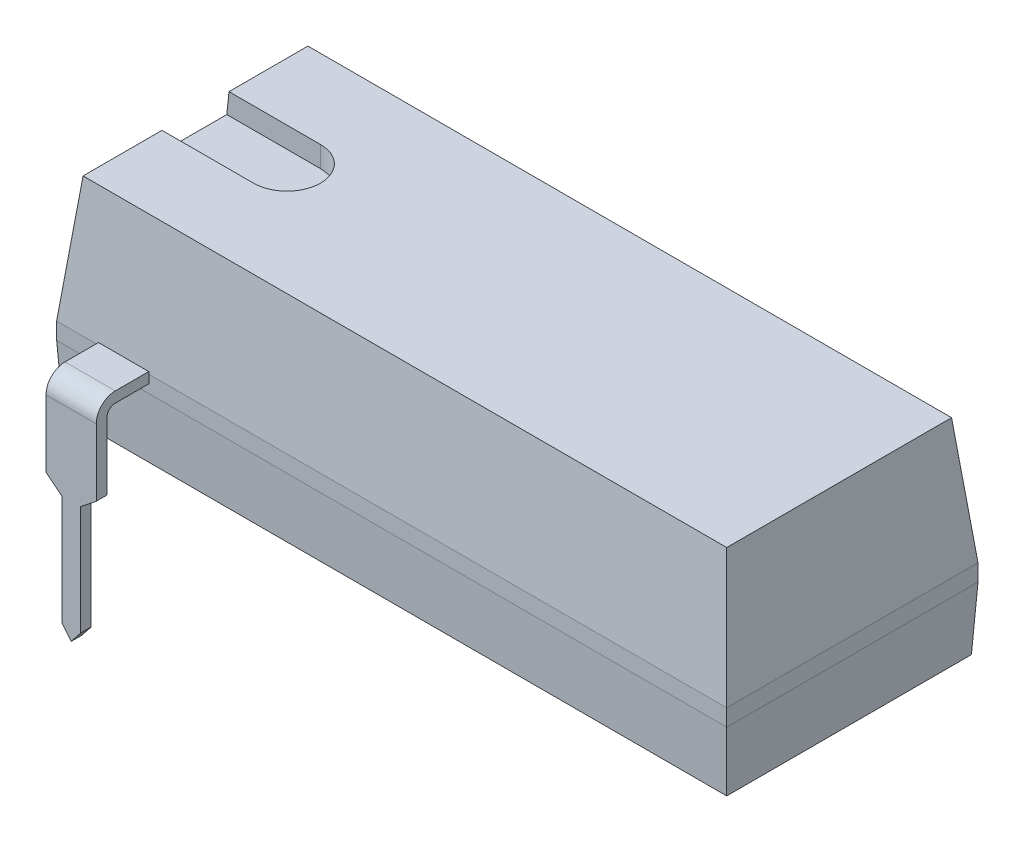
ISO-10303-21;
HEADER;
FILE_DESCRIPTION(('STEP AP214'),'2;1');
FILE_NAME('part.step','',(''),(''),'','','');
FILE_SCHEMA(('AUTOMOTIVE_DESIGN { 1 0 10303 214 1 1 1 1 }'));
ENDSEC;
DATA;
#1=APPLICATION_CONTEXT('core data for automotive mechanical design processes');
#2=APPLICATION_PROTOCOL_DEFINITION('international standard','automotive_design',2000,#1);
#3=PRODUCT_CONTEXT('',#1,'mechanical');
#4=PRODUCT('Part','Part','',(#3));
#5=PRODUCT_RELATED_PRODUCT_CATEGORY('part','',(#4));
#6=PRODUCT_DEFINITION_FORMATION('','',#4);
#7=PRODUCT_DEFINITION_CONTEXT('part definition',#1,'design');
#8=PRODUCT_DEFINITION('design','',#6,#7);
#9=PRODUCT_DEFINITION_SHAPE('','',#8);
#10=(LENGTH_UNIT() NAMED_UNIT(*) SI_UNIT(.MILLI.,.METRE.));
#11=(NAMED_UNIT(*) PLANE_ANGLE_UNIT() SI_UNIT($,.RADIAN.));
#12=(NAMED_UNIT(*) SI_UNIT($,.STERADIAN.) SOLID_ANGLE_UNIT());
#13=UNCERTAINTY_MEASURE_WITH_UNIT(LENGTH_MEASURE(1.E-05),#10,'distance_accuracy_value','');
#14=(GEOMETRIC_REPRESENTATION_CONTEXT(3) GLOBAL_UNCERTAINTY_ASSIGNED_CONTEXT((#13)) GLOBAL_UNIT_ASSIGNED_CONTEXT((#10,
#11,#12)) REPRESENTATION_CONTEXT('',''));
#15=CARTESIAN_POINT('',(0.,0.,0.));
#16=DIRECTION('',(0.,0.,1.));
#17=DIRECTION('',(1.,0.,0.));
#18=AXIS2_PLACEMENT_3D('',#15,#16,#17);
#19=CARTESIAN_POINT('',(-1.,0.4,3.));
#20=DIRECTION('',(0.,0.,-1.));
#21=DIRECTION('',(-1.,0.,0.));
#22=AXIS2_PLACEMENT_3D('',#19,#20,#21);
#23=PLANE('',#22);
#24=DIRECTION('',(0.,-1.,0.));
#25=VECTOR('',#24,1.);
#26=CARTESIAN_POINT('',(0.,0.454,3.));
#27=LINE('',#26,#25);
#28=CARTESIAN_POINT('',(0.,0.4,3.));
#29=VERTEX_POINT('',#28);
#30=CARTESIAN_POINT('',(0.,0.2,3.));
#31=VERTEX_POINT('',#30);
#32=EDGE_CURVE('E11',#29,#31,#27,.T.);
#33=ORIENTED_EDGE('',*,*,#32,.F.);
#34=DIRECTION('',(1.,0.,0.));
#35=VECTOR('',#34,1.);
#36=CARTESIAN_POINT('',(-1.,0.4,3.));
#37=LINE('',#36,#35);
#38=CARTESIAN_POINT('',(-1.,0.4,3.));
#39=VERTEX_POINT('',#38);
#40=EDGE_CURVE('E341',#39,#29,#37,.T.);
#41=ORIENTED_EDGE('',*,*,#40,.F.);
#42=DIRECTION('',(0.,-1.,0.));
#43=VECTOR('',#42,1.);
#44=CARTESIAN_POINT('',(-1.,0.4,3.));
#45=LINE('',#44,#43);
#46=CARTESIAN_POINT('',(-1.,0.,3.));
#47=VERTEX_POINT('',#46);
#48=EDGE_CURVE('E370',#39,#47,#45,.T.);
#49=ORIENTED_EDGE('',*,*,#48,.T.);
#50=DIRECTION('',(1.,0.,0.));
#51=VECTOR('',#50,1.);
#52=CARTESIAN_POINT('',(-1.,0.,3.));
#53=LINE('',#52,#51);
#54=CARTESIAN_POINT('',(15.,0.,3.));
#55=VERTEX_POINT('',#54);
#56=EDGE_CURVE('E354',#47,#55,#53,.T.);
#57=ORIENTED_EDGE('',*,*,#56,.T.);
#58=DIRECTION('',(0.,-1.,0.));
#59=VECTOR('',#58,1.);
#60=CARTESIAN_POINT('',(15.,0.4,3.));
#61=LINE('',#60,#59);
#62=CARTESIAN_POINT('',(15.,0.4,3.));
#63=VERTEX_POINT('',#62);
#64=EDGE_CURVE('E367',#63,#55,#61,.T.);
#65=ORIENTED_EDGE('',*,*,#64,.F.);
#66=CARTESIAN_POINT('',(1.2,0.4,3.));
#67=VERTEX_POINT('',#66);
#68=EDGE_CURVE('E339',#67,#63,#37,.T.);
#69=ORIENTED_EDGE('',*,*,#68,.F.);
#70=DIRECTION('',(0.,-1.,0.));
#71=VECTOR('',#70,1.);
#72=CARTESIAN_POINT('',(1.2,0.454,3.));
#73=LINE('',#72,#71);
#74=CARTESIAN_POINT('',(1.2,0.2,3.));
#75=VERTEX_POINT('',#74);
#76=EDGE_CURVE('E42',#67,#75,#73,.T.);
#77=ORIENTED_EDGE('',*,*,#76,.T.);
#78=DIRECTION('',(-1.,0.,0.));
#79=VECTOR('',#78,1.);
#80=CARTESIAN_POINT('',(1.2,0.2,3.));
#81=LINE('',#80,#79);
#82=EDGE_CURVE('E262',#75,#31,#81,.T.);
#83=ORIENTED_EDGE('',*,*,#82,.T.);
#84=EDGE_LOOP('',(#33,#41,#49,#57,#65,#69,#77,#83));
#85=FACE_BOUND('',#84,.T.);
#86=ADVANCED_FACE('F33',(#85),#23,.F.);
#87=CARTESIAN_POINT('',(-1.,0.4,3.));
#88=DIRECTION('',(1.,0.,0.));
#89=DIRECTION('',(0.,0.,-1.));
#90=AXIS2_PLACEMENT_3D('',#87,#88,#89);
#91=PLANE('',#90);
#92=DIRECTION('',(0.,0.,1.));
#93=VECTOR('',#92,1.);
#94=CARTESIAN_POINT('',(-1.,0.,3.));
#95=LINE('',#94,#93);
#96=CARTESIAN_POINT('',(-1.,0.,-3.));
#97=VERTEX_POINT('',#96);
#98=EDGE_CURVE('E316',#97,#47,#95,.T.);
#99=ORIENTED_EDGE('',*,*,#98,.T.);
#100=ORIENTED_EDGE('',*,*,#48,.F.);
#101=DIRECTION('',(0.,0.,1.));
#102=VECTOR('',#101,1.);
#103=CARTESIAN_POINT('',(-1.,0.4,3.));
#104=LINE('',#103,#102);
#105=CARTESIAN_POINT('',(-1.,0.4,-3.));
#106=VERTEX_POINT('',#105);
#107=EDGE_CURVE('E336',#106,#39,#104,.T.);
#108=ORIENTED_EDGE('',*,*,#107,.F.);
#109=DIRECTION('',(0.,-1.,0.));
#110=VECTOR('',#109,1.);
#111=CARTESIAN_POINT('',(-1.,0.4,-3.));
#112=LINE('',#111,#110);
#113=EDGE_CURVE('E351',#106,#97,#112,.T.);
#114=ORIENTED_EDGE('',*,*,#113,.T.);
#115=EDGE_LOOP('',(#99,#100,#108,#114));
#116=FACE_BOUND('',#115,.T.);
#117=ADVANCED_FACE('F35',(#116),#91,.F.);
#118=CARTESIAN_POINT('',(15.,0.4,3.));
#119=DIRECTION('',(-1.,0.,0.));
#120=DIRECTION('',(0.,0.,1.));
#121=AXIS2_PLACEMENT_3D('',#118,#119,#120);
#122=PLANE('',#121);
#123=DIRECTION('',(0.,0.,-1.));
#124=VECTOR('',#123,1.);
#125=CARTESIAN_POINT('',(15.,0.,3.));
#126=LINE('',#125,#124);
#127=CARTESIAN_POINT('',(15.,0.,-3.));
#128=VERTEX_POINT('',#127);
#129=EDGE_CURVE('E357',#55,#128,#126,.T.);
#130=ORIENTED_EDGE('',*,*,#129,.T.);
#131=DIRECTION('',(0.,-1.,0.));
#132=VECTOR('',#131,1.);
#133=CARTESIAN_POINT('',(15.,0.4,-3.));
#134=LINE('',#133,#132);
#135=CARTESIAN_POINT('',(15.,0.4,-3.));
#136=VERTEX_POINT('',#135);
#137=EDGE_CURVE('E364',#136,#128,#134,.T.);
#138=ORIENTED_EDGE('',*,*,#137,.F.);
#139=DIRECTION('',(0.,0.,-1.));
#140=VECTOR('',#139,1.);
#141=CARTESIAN_POINT('',(15.,0.4,3.));
#142=LINE('',#141,#140);
#143=EDGE_CURVE('E344',#63,#136,#142,.T.);
#144=ORIENTED_EDGE('',*,*,#143,.F.);
#145=ORIENTED_EDGE('',*,*,#64,.T.);
#146=EDGE_LOOP('',(#130,#138,#144,#145));
#147=FACE_BOUND('',#146,.T.);
#148=ADVANCED_FACE('F459',(#147),#122,.F.);
#149=CARTESIAN_POINT('',(-1.,0.4,-3.));
#150=DIRECTION('',(0.,0.,1.));
#151=DIRECTION('',(1.,0.,0.));
#152=AXIS2_PLACEMENT_3D('',#149,#150,#151);
#153=PLANE('',#152);
#154=DIRECTION('',(-1.,0.,0.));
#155=VECTOR('',#154,1.);
#156=CARTESIAN_POINT('',(-1.,0.,-3.));
#157=LINE('',#156,#155);
#158=EDGE_CURVE('E340',#128,#97,#157,.T.);
#159=ORIENTED_EDGE('',*,*,#158,.T.);
#160=ORIENTED_EDGE('',*,*,#113,.F.);
#161=DIRECTION('',(-1.,0.,0.));
#162=VECTOR('',#161,1.);
#163=CARTESIAN_POINT('',(-1.,0.4,-3.));
#164=LINE('',#163,#162);
#165=EDGE_CURVE('E348',#136,#106,#164,.T.);
#166=ORIENTED_EDGE('',*,*,#165,.F.);
#167=ORIENTED_EDGE('',*,*,#137,.T.);
#168=EDGE_LOOP('',(#159,#160,#166,#167));
#169=FACE_BOUND('',#168,.T.);
#170=ADVANCED_FACE('F465',(#169),#153,.F.);
#171=CARTESIAN_POINT('',(15.,0.4,-3.));
#172=DIRECTION('',(0.,0.104528463267654,-0.994521895368273));
#173=DIRECTION('',(0.,0.994521895368273,0.104528463267654));
#174=AXIS2_PLACEMENT_3D('',#171,#172,#173);
#175=PLANE('',#174);
#176=ORIENTED_EDGE('',*,*,#165,.T.);
#177=DIRECTION('',(-0.103962051184498,-0.989132844377854,-0.103962051184498));
#178=VECTOR('',#177,1.);
#179=CARTESIAN_POINT('',(-1.,0.4,-3.));
#180=LINE('',#179,#178);
#181=CARTESIAN_POINT('',(-0.684687294202971,3.4,-2.68468729420297));
#182=VERTEX_POINT('',#181);
#183=EDGE_CURVE('E313',#182,#106,#180,.T.);
#184=ORIENTED_EDGE('',*,*,#183,.F.);
#185=DIRECTION('',(1.,0.,0.));
#186=VECTOR('',#185,1.);
#187=CARTESIAN_POINT('',(15.,3.4,-2.68468729420297));
#188=LINE('',#187,#186);
#189=CARTESIAN_POINT('',(14.684687294203,3.4,-2.68468729420297));
#190=VERTEX_POINT('',#189);
#191=EDGE_CURVE('E296',#190,#182,#188,.F.);
#192=ORIENTED_EDGE('',*,*,#191,.F.);
#193=DIRECTION('',(0.103962051184498,-0.989132844377854,-0.103962051184498));
#194=VECTOR('',#193,1.);
#195=CARTESIAN_POINT('',(15.,0.4,-3.));
#196=LINE('',#195,#194);
#197=EDGE_CURVE('E318',#190,#136,#196,.T.);
#198=ORIENTED_EDGE('',*,*,#197,.T.);
#199=EDGE_LOOP('',(#176,#184,#192,#198));
#200=FACE_BOUND('',#199,.T.);
#201=ADVANCED_FACE('F469',(#200),#175,.T.);
#202=CARTESIAN_POINT('',(-1.,0.4,-3.));
#203=DIRECTION('',(-0.994521895368273,0.104528463267653,0.));
#204=DIRECTION('',(-0.104528463267653,-0.994521895368273,0.));
#205=AXIS2_PLACEMENT_3D('',#202,#203,#204);
#206=PLANE('',#205);
#207=DIRECTION('',(0.,0.,1.));
#208=VECTOR('',#207,1.);
#209=CARTESIAN_POINT('',(-0.737239411835809,2.9,-3.));
#210=LINE('',#209,#208);
#211=CARTESIAN_POINT('',(-0.737239411835809,2.9,0.8));
#212=VERTEX_POINT('',#211);
#213=CARTESIAN_POINT('',(-0.737239411835809,2.9,-0.8));
#214=VERTEX_POINT('',#213);
#215=EDGE_CURVE('E37',#212,#214,#210,.F.);
#216=ORIENTED_EDGE('',*,*,#215,.T.);
#217=DIRECTION('',(-0.104528463267653,-0.994521895368273,0.));
#218=VECTOR('',#217,1.);
#219=CARTESIAN_POINT('',(-1.,0.4,-0.8));
#220=LINE('',#219,#218);
#221=CARTESIAN_POINT('',(-0.684687294202971,3.4,-0.8));
#222=VERTEX_POINT('',#221);
#223=EDGE_CURVE('E290',#214,#222,#220,.F.);
#224=ORIENTED_EDGE('',*,*,#223,.T.);
#225=DIRECTION('',(0.,0.,-1.));
#226=VECTOR('',#225,1.);
#227=CARTESIAN_POINT('',(-0.684687294202971,3.4,-3.));
#228=LINE('',#227,#226);
#229=EDGE_CURVE('E330',#182,#222,#228,.F.);
#230=ORIENTED_EDGE('',*,*,#229,.F.);
#231=ORIENTED_EDGE('',*,*,#183,.T.);
#232=ORIENTED_EDGE('',*,*,#107,.T.);
#233=DIRECTION('',(-0.103962051184498,-0.989132844377854,0.103962051184498));
#234=VECTOR('',#233,1.);
#235=CARTESIAN_POINT('',(-1.,0.4,3.));
#236=LINE('',#235,#234);
#237=CARTESIAN_POINT('',(-0.684687294202971,3.4,2.68468729420297));
#238=VERTEX_POINT('',#237);
#239=EDGE_CURVE('E317',#238,#39,#236,.T.);
#240=ORIENTED_EDGE('',*,*,#239,.F.);
#241=CARTESIAN_POINT('',(-0.684687294202971,3.4,0.8));
#242=VERTEX_POINT('',#241);
#243=EDGE_CURVE('E329',#242,#238,#228,.F.);
#244=ORIENTED_EDGE('',*,*,#243,.F.);
#245=DIRECTION('',(0.104528463267653,0.994521895368273,0.));
#246=VECTOR('',#245,1.);
#247=CARTESIAN_POINT('',(-1.,0.4,0.800000000000001));
#248=LINE('',#247,#246);
#249=EDGE_CURVE('E285',#242,#212,#248,.F.);
#250=ORIENTED_EDGE('',*,*,#249,.T.);
#251=EDGE_LOOP('',(#216,#224,#230,#231,#232,#240,#244,#250));
#252=FACE_BOUND('',#251,.T.);
#253=ADVANCED_FACE('F471',(#252),#206,.T.);
#254=CARTESIAN_POINT('',(-1.,0.4,3.));
#255=DIRECTION('',(0.,0.104528463267653,0.994521895368273));
#256=DIRECTION('',(0.,-0.994521895368273,0.104528463267653));
#257=AXIS2_PLACEMENT_3D('',#254,#255,#256);
#258=PLANE('',#257);
#259=ORIENTED_EDGE('',*,*,#40,.T.);
#260=EDGE_CURVE('E345',#29,#67,#37,.T.);
#261=ORIENTED_EDGE('',*,*,#260,.T.);
#262=ORIENTED_EDGE('',*,*,#68,.T.);
#263=DIRECTION('',(0.103962051184498,-0.989132844377854,0.103962051184498));
#264=VECTOR('',#263,1.);
#265=CARTESIAN_POINT('',(15.,0.4,3.));
#266=LINE('',#265,#264);
#267=CARTESIAN_POINT('',(14.684687294203,3.4,2.68468729420297));
#268=VERTEX_POINT('',#267);
#269=EDGE_CURVE('E321',#268,#63,#266,.T.);
#270=ORIENTED_EDGE('',*,*,#269,.F.);
#271=DIRECTION('',(-1.,0.,0.));
#272=VECTOR('',#271,1.);
#273=CARTESIAN_POINT('',(-1.,3.4,2.68468729420297));
#274=LINE('',#273,#272);
#275=EDGE_CURVE('E333',#238,#268,#274,.F.);
#276=ORIENTED_EDGE('',*,*,#275,.F.);
#277=ORIENTED_EDGE('',*,*,#239,.T.);
#278=EDGE_LOOP('',(#259,#261,#262,#270,#276,#277));
#279=FACE_BOUND('',#278,.T.);
#280=ADVANCED_FACE('F474',(#279),#258,.T.);
#281=CARTESIAN_POINT('',(15.,0.4,3.));
#282=DIRECTION('',(0.994521895368273,0.104528463267653,0.));
#283=DIRECTION('',(-0.104528463267653,0.994521895368273,0.));
#284=AXIS2_PLACEMENT_3D('',#281,#282,#283);
#285=PLANE('',#284);
#286=ORIENTED_EDGE('',*,*,#143,.T.);
#287=ORIENTED_EDGE('',*,*,#197,.F.);
#288=DIRECTION('',(0.,0.,1.));
#289=VECTOR('',#288,1.);
#290=CARTESIAN_POINT('',(14.684687294203,3.4,3.));
#291=LINE('',#290,#289);
#292=EDGE_CURVE('E322',#268,#190,#291,.F.);
#293=ORIENTED_EDGE('',*,*,#292,.F.);
#294=ORIENTED_EDGE('',*,*,#269,.T.);
#295=EDGE_LOOP('',(#286,#287,#293,#294));
#296=FACE_BOUND('',#295,.T.);
#297=ADVANCED_FACE('F477',(#296),#285,.T.);
#298=CARTESIAN_POINT('',(-1.,3.4,-3.));
#299=DIRECTION('',(0.,1.,0.));
#300=DIRECTION('',(0.,0.,1.));
#301=AXIS2_PLACEMENT_3D('',#298,#299,#300);
#302=PLANE('',#301);
#303=DIRECTION('',(-1.,0.,0.));
#304=VECTOR('',#303,1.);
#305=CARTESIAN_POINT('',(-1.,3.4,-0.8));
#306=LINE('',#305,#304);
#307=CARTESIAN_POINT('',(1.5,3.4,-0.8));
#308=VERTEX_POINT('',#307);
#309=EDGE_CURVE('E273',#308,#222,#306,.T.);
#310=ORIENTED_EDGE('',*,*,#309,.F.);
#311=CARTESIAN_POINT('',(1.5,3.4,0.));
#312=DIRECTION('',(0.,1.,0.));
#313=DIRECTION('',(0.,0.,-1.));
#314=AXIS2_PLACEMENT_3D('',#311,#312,#313);
#315=CIRCLE('',#314,0.8);
#316=CARTESIAN_POINT('',(1.5,3.4,0.8));
#317=VERTEX_POINT('',#316);
#318=EDGE_CURVE('E269',#317,#308,#315,.T.);
#319=ORIENTED_EDGE('',*,*,#318,.F.);
#320=DIRECTION('',(1.,0.,0.));
#321=VECTOR('',#320,1.);
#322=CARTESIAN_POINT('',(-1.,3.4,0.800000000000001));
#323=LINE('',#322,#321);
#324=EDGE_CURVE('E372',#242,#317,#323,.T.);
#325=ORIENTED_EDGE('',*,*,#324,.F.);
#326=ORIENTED_EDGE('',*,*,#243,.T.);
#327=ORIENTED_EDGE('',*,*,#275,.T.);
#328=ORIENTED_EDGE('',*,*,#292,.T.);
#329=ORIENTED_EDGE('',*,*,#191,.T.);
#330=ORIENTED_EDGE('',*,*,#229,.T.);
#331=EDGE_LOOP('',(#310,#319,#325,#326,#327,#328,#329,#330));
#332=FACE_BOUND('',#331,.T.);
#333=ADVANCED_FACE('F481',(#332),#302,.T.);
#334=CARTESIAN_POINT('',(15.,0.,3.));
#335=DIRECTION('',(0.,-0.0523359562429439,0.998629534754574));
#336=DIRECTION('',(0.,-0.998629534754574,-0.0523359562429439));
#337=AXIS2_PLACEMENT_3D('',#334,#335,#336);
#338=PLANE('',#337);
#339=ORIENTED_EDGE('',*,*,#56,.F.);
#340=DIRECTION('',(-0.052264427688714,0.997264688634237,0.052264427688714));
#341=VECTOR('',#340,1.);
#342=CARTESIAN_POINT('',(-1.,0.,3.));
#343=LINE('',#342,#341);
#344=CARTESIAN_POINT('',(-0.921388331075438,-1.5,2.92138833107544));
#345=VERTEX_POINT('',#344);
#346=EDGE_CURVE('E294',#345,#47,#343,.T.);
#347=ORIENTED_EDGE('',*,*,#346,.F.);
#348=DIRECTION('',(1.,0.,0.));
#349=VECTOR('',#348,1.);
#350=CARTESIAN_POINT('',(15.,-1.5,2.92138833107544));
#351=LINE('',#350,#349);
#352=CARTESIAN_POINT('',(14.9213883310754,-1.5,2.92138833107544));
#353=VERTEX_POINT('',#352);
#354=EDGE_CURVE('E293',#353,#345,#351,.F.);
#355=ORIENTED_EDGE('',*,*,#354,.F.);
#356=DIRECTION('',(0.052264427688714,0.997264688634237,0.052264427688714));
#357=VECTOR('',#356,1.);
#358=CARTESIAN_POINT('',(15.,0.,3.));
#359=LINE('',#358,#357);
#360=EDGE_CURVE('E298',#353,#55,#359,.T.);
#361=ORIENTED_EDGE('',*,*,#360,.T.);
#362=EDGE_LOOP('',(#339,#347,#355,#361));
#363=FACE_BOUND('',#362,.T.);
#364=ADVANCED_FACE('F488',(#363),#338,.T.);
#365=CARTESIAN_POINT('',(-1.,0.,3.));
#366=DIRECTION('',(-0.998629534754574,-0.0523359562429439,0.));
#367=DIRECTION('',(0.0523359562429439,-0.998629534754574,0.));
#368=AXIS2_PLACEMENT_3D('',#365,#366,#367);
#369=PLANE('',#368);
#370=ORIENTED_EDGE('',*,*,#98,.F.);
#371=DIRECTION('',(-0.052264427688714,0.997264688634237,-0.0522644276887139));
#372=VECTOR('',#371,1.);
#373=CARTESIAN_POINT('',(-1.,0.,-3.));
#374=LINE('',#373,#372);
#375=CARTESIAN_POINT('',(-0.921388331075439,-1.5,-2.92138833107544));
#376=VERTEX_POINT('',#375);
#377=EDGE_CURVE('E297',#376,#97,#374,.T.);
#378=ORIENTED_EDGE('',*,*,#377,.F.);
#379=DIRECTION('',(0.,0.,1.));
#380=VECTOR('',#379,1.);
#381=CARTESIAN_POINT('',(-0.921388331075438,-1.5,3.));
#382=LINE('',#381,#380);
#383=EDGE_CURVE('E308',#345,#376,#382,.F.);
#384=ORIENTED_EDGE('',*,*,#383,.F.);
#385=ORIENTED_EDGE('',*,*,#346,.T.);
#386=EDGE_LOOP('',(#370,#378,#384,#385));
#387=FACE_BOUND('',#386,.T.);
#388=ADVANCED_FACE('F490',(#387),#369,.T.);
#389=CARTESIAN_POINT('',(-1.,0.,-3.));
#390=DIRECTION('',(0.,-0.0523359562429438,-0.998629534754574));
#391=DIRECTION('',(0.,0.998629534754574,-0.0523359562429438));
#392=AXIS2_PLACEMENT_3D('',#389,#390,#391);
#393=PLANE('',#392);
#394=ORIENTED_EDGE('',*,*,#158,.F.);
#395=DIRECTION('',(0.052264427688714,0.997264688634237,-0.0522644276887139));
#396=VECTOR('',#395,1.);
#397=CARTESIAN_POINT('',(15.,0.,-3.));
#398=LINE('',#397,#396);
#399=CARTESIAN_POINT('',(14.9213883310754,-1.5,-2.92138833107544));
#400=VERTEX_POINT('',#399);
#401=EDGE_CURVE('E300',#400,#128,#398,.T.);
#402=ORIENTED_EDGE('',*,*,#401,.F.);
#403=DIRECTION('',(-1.,0.,0.));
#404=VECTOR('',#403,1.);
#405=CARTESIAN_POINT('',(-1.,-1.5,-2.92138833107544));
#406=LINE('',#405,#404);
#407=EDGE_CURVE('E310',#376,#400,#406,.F.);
#408=ORIENTED_EDGE('',*,*,#407,.F.);
#409=ORIENTED_EDGE('',*,*,#377,.T.);
#410=EDGE_LOOP('',(#394,#402,#408,#409));
#411=FACE_BOUND('',#410,.T.);
#412=ADVANCED_FACE('F493',(#411),#393,.T.);
#413=CARTESIAN_POINT('',(15.,0.,-3.));
#414=DIRECTION('',(0.998629534754574,-0.0523359562429439,0.));
#415=DIRECTION('',(0.0523359562429439,0.998629534754574,0.));
#416=AXIS2_PLACEMENT_3D('',#413,#414,#415);
#417=PLANE('',#416);
#418=ORIENTED_EDGE('',*,*,#129,.F.);
#419=ORIENTED_EDGE('',*,*,#360,.F.);
#420=DIRECTION('',(0.,0.,-1.));
#421=VECTOR('',#420,1.);
#422=CARTESIAN_POINT('',(14.9213883310754,-1.5,-3.));
#423=LINE('',#422,#421);
#424=EDGE_CURVE('E301',#400,#353,#423,.F.);
#425=ORIENTED_EDGE('',*,*,#424,.F.);
#426=ORIENTED_EDGE('',*,*,#401,.T.);
#427=EDGE_LOOP('',(#418,#419,#425,#426));
#428=FACE_BOUND('',#427,.T.);
#429=ADVANCED_FACE('F497',(#428),#417,.T.);
#430=CARTESIAN_POINT('',(-1.,-1.5,3.));
#431=DIRECTION('',(0.,-1.,0.));
#432=DIRECTION('',(0.,0.,-1.));
#433=AXIS2_PLACEMENT_3D('',#430,#431,#432);
#434=PLANE('',#433);
#435=ORIENTED_EDGE('',*,*,#354,.T.);
#436=ORIENTED_EDGE('',*,*,#383,.T.);
#437=ORIENTED_EDGE('',*,*,#407,.T.);
#438=ORIENTED_EDGE('',*,*,#424,.T.);
#439=EDGE_LOOP('',(#435,#436,#437,#438));
#440=FACE_BOUND('',#439,.T.);
#441=ADVANCED_FACE('F501',(#440),#434,.T.);
#442=CARTESIAN_POINT('',(1.5,2.9,0.));
#443=DIRECTION('',(0.,-1.,0.));
#444=DIRECTION('',(0.,0.,-1.));
#445=AXIS2_PLACEMENT_3D('',#442,#443,#444);
#446=PLANE('',#445);
#447=DIRECTION('',(1.,0.,0.));
#448=VECTOR('',#447,1.);
#449=CARTESIAN_POINT('',(1.5,2.9,0.8));
#450=LINE('',#449,#448);
#451=CARTESIAN_POINT('',(1.5,2.9,0.8));
#452=VERTEX_POINT('',#451);
#453=EDGE_CURVE('E270',#212,#452,#450,.T.);
#454=ORIENTED_EDGE('',*,*,#453,.T.);
#455=CARTESIAN_POINT('',(1.5,2.9,0.));
#456=DIRECTION('',(0.,1.,0.));
#457=DIRECTION('',(0.,0.,-1.));
#458=AXIS2_PLACEMENT_3D('',#455,#456,#457);
#459=CIRCLE('',#458,0.8);
#460=CARTESIAN_POINT('',(1.5,2.9,-0.8));
#461=VERTEX_POINT('',#460);
#462=EDGE_CURVE('E272',#452,#461,#459,.T.);
#463=ORIENTED_EDGE('',*,*,#462,.T.);
#464=DIRECTION('',(-1.,0.,0.));
#465=VECTOR('',#464,1.);
#466=CARTESIAN_POINT('',(-1.,2.9,-0.8));
#467=LINE('',#466,#465);
#468=EDGE_CURVE('E276',#461,#214,#467,.T.);
#469=ORIENTED_EDGE('',*,*,#468,.T.);
#470=ORIENTED_EDGE('',*,*,#215,.F.);
#471=EDGE_LOOP('',(#454,#463,#469,#470));
#472=FACE_BOUND('',#471,.T.);
#473=ADVANCED_FACE('F508',(#472),#446,.F.);
#474=CARTESIAN_POINT('',(-1.,2.9,-0.8));
#475=DIRECTION('',(0.,0.,-1.));
#476=DIRECTION('',(0.,1.,0.));
#477=AXIS2_PLACEMENT_3D('',#474,#475,#476);
#478=PLANE('',#477);
#479=ORIENTED_EDGE('',*,*,#468,.F.);
#480=DIRECTION('',(0.,1.,0.));
#481=VECTOR('',#480,1.);
#482=CARTESIAN_POINT('',(1.5,2.9,-0.8));
#483=LINE('',#482,#481);
#484=EDGE_CURVE('E283',#461,#308,#483,.T.);
#485=ORIENTED_EDGE('',*,*,#484,.T.);
#486=ORIENTED_EDGE('',*,*,#309,.T.);
#487=ORIENTED_EDGE('',*,*,#223,.F.);
#488=EDGE_LOOP('',(#479,#485,#486,#487));
#489=FACE_BOUND('',#488,.T.);
#490=ADVANCED_FACE('F514',(#489),#478,.F.);
#491=CARTESIAN_POINT('',(1.5,2.9,0.8));
#492=DIRECTION('',(0.,0.,1.));
#493=DIRECTION('',(1.,0.,0.));
#494=AXIS2_PLACEMENT_3D('',#491,#492,#493);
#495=PLANE('',#494);
#496=ORIENTED_EDGE('',*,*,#324,.T.);
#497=DIRECTION('',(0.,1.,0.));
#498=VECTOR('',#497,1.);
#499=CARTESIAN_POINT('',(1.5,2.9,0.8));
#500=LINE('',#499,#498);
#501=EDGE_CURVE('E279',#452,#317,#500,.T.);
#502=ORIENTED_EDGE('',*,*,#501,.F.);
#503=ORIENTED_EDGE('',*,*,#453,.F.);
#504=ORIENTED_EDGE('',*,*,#249,.F.);
#505=EDGE_LOOP('',(#496,#502,#503,#504));
#506=FACE_BOUND('',#505,.T.);
#507=ADVANCED_FACE('F510',(#506),#495,.F.);
#508=CARTESIAN_POINT('',(1.5,2.9,0.));
#509=DIRECTION('',(0.,1.,0.));
#510=DIRECTION('',(0.,0.,1.));
#511=AXIS2_PLACEMENT_3D('',#508,#509,#510);
#512=CYLINDRICAL_SURFACE('',#511,0.8);
#513=ORIENTED_EDGE('',*,*,#318,.T.);
#514=ORIENTED_EDGE('',*,*,#484,.F.);
#515=ORIENTED_EDGE('',*,*,#462,.F.);
#516=ORIENTED_EDGE('',*,*,#501,.T.);
#517=EDGE_LOOP('',(#513,#514,#515,#516));
#518=FACE_BOUND('',#517,.T.);
#519=ADVANCED_FACE('F513',(#518),#512,.F.);
#520=CARTESIAN_POINT('',(1.2,0.454,3.));
#521=DIRECTION('',(0.,0.,-1.));
#522=DIRECTION('',(-1.,0.,0.));
#523=AXIS2_PLACEMENT_3D('',#520,#521,#522);
#524=PLANE('',#523);
#525=ORIENTED_EDGE('',*,*,#260,.F.);
#526=CARTESIAN_POINT('',(0.,0.454,3.));
#527=VERTEX_POINT('',#526);
#528=EDGE_CURVE('E44',#527,#29,#27,.T.);
#529=ORIENTED_EDGE('',*,*,#528,.F.);
#530=DIRECTION('',(-1.,0.,0.));
#531=VECTOR('',#530,1.);
#532=CARTESIAN_POINT('',(1.2,0.454,3.));
#533=LINE('',#532,#531);
#534=CARTESIAN_POINT('',(1.2,0.454,3.));
#535=VERTEX_POINT('',#534);
#536=EDGE_CURVE('E260',#535,#527,#533,.T.);
#537=ORIENTED_EDGE('',*,*,#536,.F.);
#538=EDGE_CURVE('E380',#535,#67,#73,.T.);
#539=ORIENTED_EDGE('',*,*,#538,.T.);
#540=EDGE_LOOP('',(#525,#529,#537,#539));
#541=FACE_BOUND('',#540,.T.);
#542=ADVANCED_FACE('F517',(#541),#524,.T.);
#543=CARTESIAN_POINT('',(1.2,0.,4.254));
#544=DIRECTION('',(0.,0.,-1.));
#545=DIRECTION('',(0.,1.,0.));
#546=AXIS2_PLACEMENT_3D('',#543,#544,#545);
#547=PLANE('',#546);
#548=DIRECTION('',(0.,1.,0.));
#549=VECTOR('',#548,1.);
#550=CARTESIAN_POINT('',(0.376968927897254,-4.51815213389866,4.254));
#551=LINE('',#550,#549);
#552=CARTESIAN_POINT('',(0.376968927897254,-4.51815213389866,4.254));
#553=VERTEX_POINT('',#552);
#554=CARTESIAN_POINT('',(0.376968927897254,-1.89980256511421,4.254));
#555=VERTEX_POINT('',#554);
#556=EDGE_CURVE('E219',#553,#555,#551,.T.);
#557=ORIENTED_EDGE('',*,*,#556,.F.);
#558=DIRECTION('',(-0.620534480732402,0.784179162068317,0.));
#559=VECTOR('',#558,1.);
#560=CARTESIAN_POINT('',(0.6,-4.8,4.254));
#561=LINE('',#560,#559);
#562=CARTESIAN_POINT('',(0.6,-4.8,4.254));
#563=VERTEX_POINT('',#562);
#564=EDGE_CURVE('E425',#563,#553,#561,.T.);
#565=ORIENTED_EDGE('',*,*,#564,.F.);
#566=DIRECTION('',(-0.620534480732402,-0.784179162068317,0.));
#567=VECTOR('',#566,1.);
#568=CARTESIAN_POINT('',(0.6,-4.8,4.254));
#569=LINE('',#568,#567);
#570=CARTESIAN_POINT('',(0.823031072102746,-4.51815213389866,4.254));
#571=VERTEX_POINT('',#570);
#572=EDGE_CURVE('E401',#571,#563,#569,.T.);
#573=ORIENTED_EDGE('',*,*,#572,.F.);
#574=DIRECTION('',(0.,-1.,0.));
#575=VECTOR('',#574,1.);
#576=CARTESIAN_POINT('',(0.823031072102746,-4.51815213389866,4.254));
#577=LINE('',#576,#575);
#578=CARTESIAN_POINT('',(0.823031072102746,-1.89980256511421,4.254));
#579=VERTEX_POINT('',#578);
#580=EDGE_CURVE('E412',#579,#571,#577,.T.);
#581=ORIENTED_EDGE('',*,*,#580,.F.);
#582=DIRECTION('',(-0.7836628263905,-0.621186424943152,0.));
#583=VECTOR('',#582,1.);
#584=CARTESIAN_POINT('',(0.823031072102746,-1.89980256511421,4.254));
#585=LINE('',#584,#583);
#586=CARTESIAN_POINT('',(1.2,-1.60099040668415,4.254));
#587=VERTEX_POINT('',#586);
#588=EDGE_CURVE('E230',#587,#579,#585,.T.);
#589=ORIENTED_EDGE('',*,*,#588,.F.);
#590=DIRECTION('',(0.,-1.,0.));
#591=VECTOR('',#590,1.);
#592=CARTESIAN_POINT('',(1.2,0.,4.254));
#593=LINE('',#592,#591);
#594=CARTESIAN_POINT('',(1.2,0.,4.254));
#595=VERTEX_POINT('',#594);
#596=EDGE_CURVE('E255',#595,#587,#593,.T.);
#597=ORIENTED_EDGE('',*,*,#596,.F.);
#598=DIRECTION('',(-1.,0.,0.));
#599=VECTOR('',#598,1.);
#600=CARTESIAN_POINT('',(1.2,0.,4.254));
#601=LINE('',#600,#599);
#602=CARTESIAN_POINT('',(0.,0.,4.254));
#603=VERTEX_POINT('',#602);
#604=EDGE_CURVE('E237',#595,#603,#601,.T.);
#605=ORIENTED_EDGE('',*,*,#604,.T.);
#606=DIRECTION('',(0.,-1.,0.));
#607=VECTOR('',#606,1.);
#608=CARTESIAN_POINT('',(0.,0.,4.254));
#609=LINE('',#608,#607);
#610=CARTESIAN_POINT('',(0.,-1.60099040668415,4.254));
#611=VERTEX_POINT('',#610);
#612=EDGE_CURVE('E226',#603,#611,#609,.T.);
#613=ORIENTED_EDGE('',*,*,#612,.T.);
#614=DIRECTION('',(-0.7836628263905,0.621186424943152,0.));
#615=VECTOR('',#614,1.);
#616=CARTESIAN_POINT('',(0.376968927897254,-1.89980256511421,4.254));
#617=LINE('',#616,#615);
#618=EDGE_CURVE('E207',#555,#611,#617,.T.);
#619=ORIENTED_EDGE('',*,*,#618,.F.);
#620=EDGE_LOOP('',(#557,#565,#573,#581,#589,#597,#605,#613,#619));
#621=FACE_BOUND('',#620,.T.);
#622=ADVANCED_FACE('F234',(#621),#547,.F.);
#623=CARTESIAN_POINT('',(1.2,0.,4.));
#624=DIRECTION('',(0.,0.,-1.));
#625=DIRECTION('',(0.,1.,0.));
#626=AXIS2_PLACEMENT_3D('',#623,#624,#625);
#627=PLANE('',#626);
#628=DIRECTION('',(-0.620534480732402,0.784179162068317,0.));
#629=VECTOR('',#628,1.);
#630=CARTESIAN_POINT('',(0.600000000000001,-4.8,4.));
#631=LINE('',#630,#629);
#632=CARTESIAN_POINT('',(0.6,-4.8,4.));
#633=VERTEX_POINT('',#632);
#634=CARTESIAN_POINT('',(0.376968927897254,-4.51815213389866,4.));
#635=VERTEX_POINT('',#634);
#636=EDGE_CURVE('E218',#633,#635,#631,.T.);
#637=ORIENTED_EDGE('',*,*,#636,.T.);
#638=DIRECTION('',(0.,1.,0.));
#639=VECTOR('',#638,1.);
#640=CARTESIAN_POINT('',(0.376968927897254,-4.51815213389866,4.));
#641=LINE('',#640,#639);
#642=CARTESIAN_POINT('',(0.376968927897254,-1.89980256511421,4.));
#643=VERTEX_POINT('',#642);
#644=EDGE_CURVE('E422',#635,#643,#641,.T.);
#645=ORIENTED_EDGE('',*,*,#644,.T.);
#646=DIRECTION('',(-0.7836628263905,0.621186424943152,0.));
#647=VECTOR('',#646,1.);
#648=CARTESIAN_POINT('',(0.376968927897255,-1.89980256511421,4.));
#649=LINE('',#648,#647);
#650=CARTESIAN_POINT('',(0.,-1.60099040668415,4.));
#651=VERTEX_POINT('',#650);
#652=EDGE_CURVE('E231',#643,#651,#649,.T.);
#653=ORIENTED_EDGE('',*,*,#652,.T.);
#654=DIRECTION('',(0.,-1.,0.));
#655=VECTOR('',#654,1.);
#656=CARTESIAN_POINT('',(0.,0.,4.));
#657=LINE('',#656,#655);
#658=CARTESIAN_POINT('',(0.,0.,4.));
#659=VERTEX_POINT('',#658);
#660=EDGE_CURVE('E229',#659,#651,#657,.T.);
#661=ORIENTED_EDGE('',*,*,#660,.F.);
#662=DIRECTION('',(-1.,0.,0.));
#663=VECTOR('',#662,1.);
#664=CARTESIAN_POINT('',(1.2,0.,4.));
#665=LINE('',#664,#663);
#666=CARTESIAN_POINT('',(1.2,0.,4.));
#667=VERTEX_POINT('',#666);
#668=EDGE_CURVE('E267',#667,#659,#665,.T.);
#669=ORIENTED_EDGE('',*,*,#668,.F.);
#670=DIRECTION('',(0.,-1.,0.));
#671=VECTOR('',#670,1.);
#672=CARTESIAN_POINT('',(1.2,0.,4.));
#673=LINE('',#672,#671);
#674=CARTESIAN_POINT('',(1.2,-1.60099040668415,4.));
#675=VERTEX_POINT('',#674);
#676=EDGE_CURVE('E393',#667,#675,#673,.T.);
#677=ORIENTED_EDGE('',*,*,#676,.T.);
#678=DIRECTION('',(-0.7836628263905,-0.621186424943152,0.));
#679=VECTOR('',#678,1.);
#680=CARTESIAN_POINT('',(0.823031072102745,-1.89980256511421,4.));
#681=LINE('',#680,#679);
#682=CARTESIAN_POINT('',(0.823031072102746,-1.89980256511421,4.));
#683=VERTEX_POINT('',#682);
#684=EDGE_CURVE('E51',#675,#683,#681,.T.);
#685=ORIENTED_EDGE('',*,*,#684,.T.);
#686=DIRECTION('',(0.,-1.,0.));
#687=VECTOR('',#686,1.);
#688=CARTESIAN_POINT('',(0.823031072102746,-4.51815213389866,4.));
#689=LINE('',#688,#687);
#690=CARTESIAN_POINT('',(0.823031072102746,-4.51815213389866,4.));
#691=VERTEX_POINT('',#690);
#692=EDGE_CURVE('E403',#683,#691,#689,.T.);
#693=ORIENTED_EDGE('',*,*,#692,.T.);
#694=DIRECTION('',(-0.620534480732402,-0.784179162068317,0.));
#695=VECTOR('',#694,1.);
#696=CARTESIAN_POINT('',(0.599999999999999,-4.8,4.));
#697=LINE('',#696,#695);
#698=EDGE_CURVE('E242',#691,#633,#697,.T.);
#699=ORIENTED_EDGE('',*,*,#698,.T.);
#700=EDGE_LOOP('',(#637,#645,#653,#661,#669,#677,#685,#693,#699));
#701=FACE_BOUND('',#700,.T.);
#702=ADVANCED_FACE('F433',(#701),#627,.T.);
#703=CARTESIAN_POINT('',(1.2,0.,3.8));
#704=DIRECTION('',(-1.,0.,0.));
#705=DIRECTION('',(0.,0.,1.));
#706=AXIS2_PLACEMENT_3D('',#703,#704,#705);
#707=CYLINDRICAL_SURFACE('',#706,0.2);
#708=CARTESIAN_POINT('',(0.,0.,3.8));
#709=DIRECTION('',(1.,0.,0.));
#710=DIRECTION('',(0.,0.,-1.));
#711=AXIS2_PLACEMENT_3D('',#708,#709,#710);
#712=CIRCLE('',#711,0.2);
#713=CARTESIAN_POINT('',(0.,0.2,3.8));
#714=VERTEX_POINT('',#713);
#715=EDGE_CURVE('E240',#714,#659,#712,.T.);
#716=ORIENTED_EDGE('',*,*,#715,.F.);
#717=DIRECTION('',(-1.,0.,0.));
#718=VECTOR('',#717,1.);
#719=CARTESIAN_POINT('',(1.2,0.2,3.8));
#720=LINE('',#719,#718);
#721=CARTESIAN_POINT('',(1.2,0.2,3.8));
#722=VERTEX_POINT('',#721);
#723=EDGE_CURVE('E265',#722,#714,#720,.T.);
#724=ORIENTED_EDGE('',*,*,#723,.F.);
#725=CARTESIAN_POINT('',(1.2,0.,3.8));
#726=DIRECTION('',(1.,0.,0.));
#727=DIRECTION('',(0.,0.,-1.));
#728=AXIS2_PLACEMENT_3D('',#725,#726,#727);
#729=CIRCLE('',#728,0.2);
#730=EDGE_CURVE('E390',#722,#667,#729,.T.);
#731=ORIENTED_EDGE('',*,*,#730,.T.);
#732=ORIENTED_EDGE('',*,*,#668,.T.);
#733=EDGE_LOOP('',(#716,#724,#731,#732));
#734=FACE_BOUND('',#733,.T.);
#735=ADVANCED_FACE('F529',(#734),#707,.F.);
#736=CARTESIAN_POINT('',(1.2,0.2,3.));
#737=DIRECTION('',(0.,-1.,0.));
#738=DIRECTION('',(0.,0.,-1.));
#739=AXIS2_PLACEMENT_3D('',#736,#737,#738);
#740=PLANE('',#739);
#741=DIRECTION('',(0.,0.,1.));
#742=VECTOR('',#741,1.);
#743=CARTESIAN_POINT('',(0.,0.2,3.));
#744=LINE('',#743,#742);
#745=EDGE_CURVE('E59',#31,#714,#744,.T.);
#746=ORIENTED_EDGE('',*,*,#745,.F.);
#747=ORIENTED_EDGE('',*,*,#82,.F.);
#748=DIRECTION('',(0.,0.,1.));
#749=VECTOR('',#748,1.);
#750=CARTESIAN_POINT('',(1.2,0.2,3.));
#751=LINE('',#750,#749);
#752=EDGE_CURVE('E386',#75,#722,#751,.T.);
#753=ORIENTED_EDGE('',*,*,#752,.T.);
#754=ORIENTED_EDGE('',*,*,#723,.T.);
#755=EDGE_LOOP('',(#746,#747,#753,#754));
#756=FACE_BOUND('',#755,.T.);
#757=ADVANCED_FACE('F532',(#756),#740,.T.);
#758=CARTESIAN_POINT('',(1.2,0.454,3.));
#759=DIRECTION('',(0.,-1.,0.));
#760=DIRECTION('',(0.,0.,-1.));
#761=AXIS2_PLACEMENT_3D('',#758,#759,#760);
#762=PLANE('',#761);
#763=DIRECTION('',(0.,0.,1.));
#764=VECTOR('',#763,1.);
#765=CARTESIAN_POINT('',(0.,0.454,3.));
#766=LINE('',#765,#764);
#767=CARTESIAN_POINT('',(0.,0.454,3.8));
#768=VERTEX_POINT('',#767);
#769=EDGE_CURVE('E251',#527,#768,#766,.T.);
#770=ORIENTED_EDGE('',*,*,#769,.T.);
#771=DIRECTION('',(-1.,0.,0.));
#772=VECTOR('',#771,1.);
#773=CARTESIAN_POINT('',(1.2,0.454,3.8));
#774=LINE('',#773,#772);
#775=CARTESIAN_POINT('',(1.2,0.454,3.8));
#776=VERTEX_POINT('',#775);
#777=EDGE_CURVE('E257',#776,#768,#774,.T.);
#778=ORIENTED_EDGE('',*,*,#777,.F.);
#779=DIRECTION('',(0.,0.,1.));
#780=VECTOR('',#779,1.);
#781=CARTESIAN_POINT('',(1.2,0.454,3.));
#782=LINE('',#781,#780);
#783=EDGE_CURVE('E385',#535,#776,#782,.T.);
#784=ORIENTED_EDGE('',*,*,#783,.F.);
#785=ORIENTED_EDGE('',*,*,#536,.T.);
#786=EDGE_LOOP('',(#770,#778,#784,#785));
#787=FACE_BOUND('',#786,.T.);
#788=ADVANCED_FACE('F536',(#787),#762,.F.);
#789=CARTESIAN_POINT('',(1.2,0.,3.8));
#790=DIRECTION('',(-1.,0.,0.));
#791=DIRECTION('',(0.,0.,1.));
#792=AXIS2_PLACEMENT_3D('',#789,#790,#791);
#793=CYLINDRICAL_SURFACE('',#792,0.454);
#794=CARTESIAN_POINT('',(0.,0.,3.8));
#795=DIRECTION('',(1.,0.,0.));
#796=DIRECTION('',(0.,0.,-1.));
#797=AXIS2_PLACEMENT_3D('',#794,#795,#796);
#798=CIRCLE('',#797,0.454);
#799=EDGE_CURVE('E253',#768,#603,#798,.T.);
#800=ORIENTED_EDGE('',*,*,#799,.T.);
#801=ORIENTED_EDGE('',*,*,#604,.F.);
#802=CARTESIAN_POINT('',(1.2,0.,3.8));
#803=DIRECTION('',(1.,0.,0.));
#804=DIRECTION('',(0.,0.,-1.));
#805=AXIS2_PLACEMENT_3D('',#802,#803,#804);
#806=CIRCLE('',#805,0.454);
#807=EDGE_CURVE('E245',#776,#595,#806,.T.);
#808=ORIENTED_EDGE('',*,*,#807,.F.);
#809=ORIENTED_EDGE('',*,*,#777,.T.);
#810=EDGE_LOOP('',(#800,#801,#808,#809));
#811=FACE_BOUND('',#810,.T.);
#812=ADVANCED_FACE('F541',(#811),#793,.T.);
#813=CARTESIAN_POINT('',(1.2,0.,3.8));
#814=DIRECTION('',(1.,0.,0.));
#815=DIRECTION('',(0.,0.,-1.));
#816=AXIS2_PLACEMENT_3D('',#813,#814,#815);
#817=PLANE('',#816);
#818=DIRECTION('',(0.,0.,-1.));
#819=VECTOR('',#818,1.);
#820=CARTESIAN_POINT('',(1.2,-1.60099040668415,-3.001));
#821=LINE('',#820,#819);
#822=EDGE_CURVE('E400',#587,#675,#821,.T.);
#823=ORIENTED_EDGE('',*,*,#822,.T.);
#824=ORIENTED_EDGE('',*,*,#676,.F.);
#825=ORIENTED_EDGE('',*,*,#730,.F.);
#826=ORIENTED_EDGE('',*,*,#752,.F.);
#827=ORIENTED_EDGE('',*,*,#76,.F.);
#828=ORIENTED_EDGE('',*,*,#538,.F.);
#829=ORIENTED_EDGE('',*,*,#783,.T.);
#830=ORIENTED_EDGE('',*,*,#807,.T.);
#831=ORIENTED_EDGE('',*,*,#596,.T.);
#832=EDGE_LOOP('',(#823,#824,#825,#826,#827,#828,#829,#830,#831));
#833=FACE_BOUND('',#832,.T.);
#834=ADVANCED_FACE('F545',(#833),#817,.T.);
#835=CARTESIAN_POINT('',(0.,0.,3.8));
#836=DIRECTION('',(1.,0.,0.));
#837=DIRECTION('',(0.,0.,-1.));
#838=AXIS2_PLACEMENT_3D('',#835,#836,#837);
#839=PLANE('',#838);
#840=ORIENTED_EDGE('',*,*,#660,.T.);
#841=DIRECTION('',(0.,0.,-1.));
#842=VECTOR('',#841,1.);
#843=CARTESIAN_POINT('',(0.,-1.60099040668415,-3.001));
#844=LINE('',#843,#842);
#845=EDGE_CURVE('E210',#611,#651,#844,.T.);
#846=ORIENTED_EDGE('',*,*,#845,.F.);
#847=ORIENTED_EDGE('',*,*,#612,.F.);
#848=ORIENTED_EDGE('',*,*,#799,.F.);
#849=ORIENTED_EDGE('',*,*,#769,.F.);
#850=ORIENTED_EDGE('',*,*,#528,.T.);
#851=ORIENTED_EDGE('',*,*,#32,.T.);
#852=ORIENTED_EDGE('',*,*,#745,.T.);
#853=ORIENTED_EDGE('',*,*,#715,.T.);
#854=EDGE_LOOP('',(#840,#846,#847,#848,#849,#850,#851,#852,#853));
#855=FACE_BOUND('',#854,.T.);
#856=ADVANCED_FACE('F224',(#855),#839,.F.);
#857=CARTESIAN_POINT('',(0.823031072102746,-1.89980256511421,-3.001));
#858=DIRECTION('',(-0.621186424943152,0.7836628263905,0.));
#859=DIRECTION('',(-0.7836628263905,-0.621186424943152,0.));
#860=AXIS2_PLACEMENT_3D('',#857,#858,#859);
#861=PLANE('',#860);
#862=ORIENTED_EDGE('',*,*,#822,.F.);
#863=ORIENTED_EDGE('',*,*,#588,.T.);
#864=DIRECTION('',(0.,0.,1.));
#865=VECTOR('',#864,1.);
#866=CARTESIAN_POINT('',(0.823031072102746,-1.89980256511421,-3.001));
#867=LINE('',#866,#865);
#868=EDGE_CURVE('E407',#683,#579,#867,.T.);
#869=ORIENTED_EDGE('',*,*,#868,.F.);
#870=ORIENTED_EDGE('',*,*,#684,.F.);
#871=EDGE_LOOP('',(#862,#863,#869,#870));
#872=FACE_BOUND('',#871,.T.);
#873=ADVANCED_FACE('F549',(#872),#861,.F.);
#874=CARTESIAN_POINT('',(0.823031072102746,-4.51815213389866,-3.001));
#875=DIRECTION('',(-1.,0.,0.));
#876=DIRECTION('',(0.,0.,1.));
#877=AXIS2_PLACEMENT_3D('',#874,#875,#876);
#878=PLANE('',#877);
#879=ORIENTED_EDGE('',*,*,#868,.T.);
#880=ORIENTED_EDGE('',*,*,#580,.T.);
#881=DIRECTION('',(0.,0.,1.));
#882=VECTOR('',#881,1.);
#883=CARTESIAN_POINT('',(0.823031072102746,-4.51815213389866,-3.001));
#884=LINE('',#883,#882);
#885=EDGE_CURVE('E406',#691,#571,#884,.T.);
#886=ORIENTED_EDGE('',*,*,#885,.F.);
#887=ORIENTED_EDGE('',*,*,#692,.F.);
#888=EDGE_LOOP('',(#879,#880,#886,#887));
#889=FACE_BOUND('',#888,.T.);
#890=ADVANCED_FACE('F555',(#889),#878,.F.);
#891=CARTESIAN_POINT('',(0.6,-4.8,-3.001));
#892=DIRECTION('',(-0.784179162068317,0.620534480732402,0.));
#893=DIRECTION('',(-0.620534480732402,-0.784179162068317,0.));
#894=AXIS2_PLACEMENT_3D('',#891,#892,#893);
#895=PLANE('',#894);
#896=ORIENTED_EDGE('',*,*,#885,.T.);
#897=ORIENTED_EDGE('',*,*,#572,.T.);
#898=DIRECTION('',(0.,0.,1.));
#899=VECTOR('',#898,1.);
#900=CARTESIAN_POINT('',(0.6,-4.8,-3.001));
#901=LINE('',#900,#899);
#902=EDGE_CURVE('E238',#633,#563,#901,.T.);
#903=ORIENTED_EDGE('',*,*,#902,.F.);
#904=ORIENTED_EDGE('',*,*,#698,.F.);
#905=EDGE_LOOP('',(#896,#897,#903,#904));
#906=FACE_BOUND('',#905,.T.);
#907=ADVANCED_FACE('F441',(#906),#895,.F.);
#908=CARTESIAN_POINT('',(0.6,-4.8,-3.001));
#909=DIRECTION('',(0.784179162068317,0.620534480732402,0.));
#910=DIRECTION('',(-0.620534480732402,0.784179162068317,0.));
#911=AXIS2_PLACEMENT_3D('',#908,#909,#910);
#912=PLANE('',#911);
#913=ORIENTED_EDGE('',*,*,#902,.T.);
#914=ORIENTED_EDGE('',*,*,#564,.T.);
#915=DIRECTION('',(0.,0.,1.));
#916=VECTOR('',#915,1.);
#917=CARTESIAN_POINT('',(0.376968927897254,-4.51815213389866,-3.001));
#918=LINE('',#917,#916);
#919=EDGE_CURVE('E420',#635,#553,#918,.T.);
#920=ORIENTED_EDGE('',*,*,#919,.F.);
#921=ORIENTED_EDGE('',*,*,#636,.F.);
#922=EDGE_LOOP('',(#913,#914,#920,#921));
#923=FACE_BOUND('',#922,.T.);
#924=ADVANCED_FACE('F438',(#923),#912,.F.);
#925=CARTESIAN_POINT('',(0.376968927897254,-4.51815213389866,-3.001));
#926=DIRECTION('',(1.,0.,0.));
#927=DIRECTION('',(0.,0.,-1.));
#928=AXIS2_PLACEMENT_3D('',#925,#926,#927);
#929=PLANE('',#928);
#930=ORIENTED_EDGE('',*,*,#919,.T.);
#931=ORIENTED_EDGE('',*,*,#556,.T.);
#932=DIRECTION('',(0.,0.,1.));
#933=VECTOR('',#932,1.);
#934=CARTESIAN_POINT('',(0.376968927897254,-1.89980256511421,-3.001));
#935=LINE('',#934,#933);
#936=EDGE_CURVE('E213',#643,#555,#935,.T.);
#937=ORIENTED_EDGE('',*,*,#936,.F.);
#938=ORIENTED_EDGE('',*,*,#644,.F.);
#939=EDGE_LOOP('',(#930,#931,#937,#938));
#940=FACE_BOUND('',#939,.T.);
#941=ADVANCED_FACE('F446',(#940),#929,.F.);
#942=CARTESIAN_POINT('',(0.376968927897254,-1.89980256511421,-3.001));
#943=DIRECTION('',(0.621186424943152,0.7836628263905,0.));
#944=DIRECTION('',(-0.7836628263905,0.621186424943152,0.));
#945=AXIS2_PLACEMENT_3D('',#942,#943,#944);
#946=PLANE('',#945);
#947=ORIENTED_EDGE('',*,*,#936,.T.);
#948=ORIENTED_EDGE('',*,*,#618,.T.);
#949=ORIENTED_EDGE('',*,*,#845,.T.);
#950=ORIENTED_EDGE('',*,*,#652,.F.);
#951=EDGE_LOOP('',(#947,#948,#949,#950));
#952=FACE_BOUND('',#951,.T.);
#953=ADVANCED_FACE('F209',(#952),#946,.F.);
#954=CLOSED_SHELL('',(#86,#117,#148,#170,#201,#253,#280,#297,#333,#364,#388,#412,#429,#441,#473,
#490,#507,#519,#542,#622,#702,#735,#757,#788,#812,#834,#856,#873,#890,#907,#924,#941,#953));
#955=MANIFOLD_SOLID_BREP('B2',#954);
#956=ADVANCED_BREP_SHAPE_REPRESENTATION('',(#18,#955),#14);
#957=SHAPE_DEFINITION_REPRESENTATION(#9,#956);
ENDSEC;
END-ISO-10303-21;
